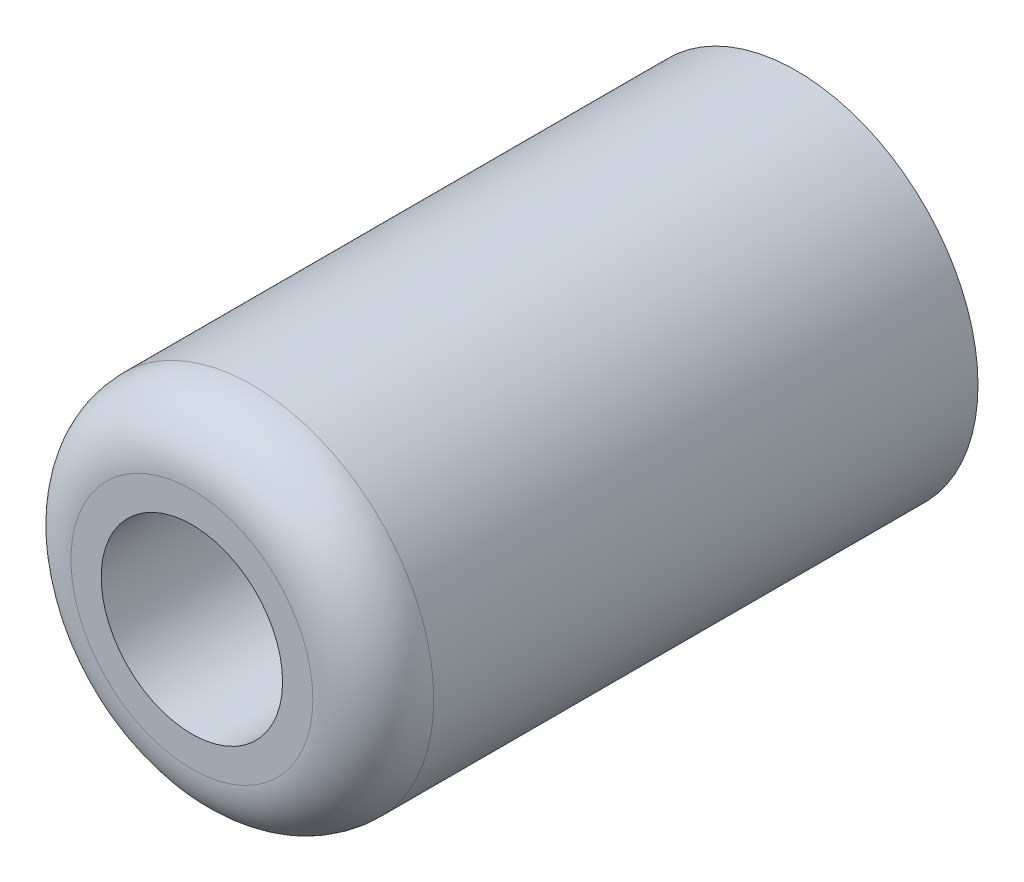
ISO-10303-21;
HEADER;
FILE_DESCRIPTION(('STEP AP214'),'2;1');
FILE_NAME('part.step','',(''),(''),'','','');
FILE_SCHEMA(('AUTOMOTIVE_DESIGN { 1 0 10303 214 1 1 1 1 }'));
ENDSEC;
DATA;
#1=APPLICATION_CONTEXT('core data for automotive mechanical design processes');
#2=APPLICATION_PROTOCOL_DEFINITION('international standard','automotive_design',2000,#1);
#3=PRODUCT_CONTEXT('',#1,'mechanical');
#4=PRODUCT('Part','Part','',(#3));
#5=PRODUCT_RELATED_PRODUCT_CATEGORY('part','',(#4));
#6=PRODUCT_DEFINITION_FORMATION('','',#4);
#7=PRODUCT_DEFINITION_CONTEXT('part definition',#1,'design');
#8=PRODUCT_DEFINITION('design','',#6,#7);
#9=PRODUCT_DEFINITION_SHAPE('','',#8);
#10=(LENGTH_UNIT() NAMED_UNIT(*) SI_UNIT(.MILLI.,.METRE.));
#11=(NAMED_UNIT(*) PLANE_ANGLE_UNIT() SI_UNIT($,.RADIAN.));
#12=(NAMED_UNIT(*) SI_UNIT($,.STERADIAN.) SOLID_ANGLE_UNIT());
#13=UNCERTAINTY_MEASURE_WITH_UNIT(LENGTH_MEASURE(1.E-05),#10,'distance_accuracy_value','');
#14=(GEOMETRIC_REPRESENTATION_CONTEXT(3) GLOBAL_UNCERTAINTY_ASSIGNED_CONTEXT((#13)) GLOBAL_UNIT_ASSIGNED_CONTEXT((#10,
#11,#12)) REPRESENTATION_CONTEXT('',''));
#15=CARTESIAN_POINT('',(0.,0.,0.));
#16=DIRECTION('',(0.,0.,1.));
#17=DIRECTION('',(1.,0.,0.));
#18=AXIS2_PLACEMENT_3D('',#15,#16,#17);
#19=CARTESIAN_POINT('',(0.,0.,20.));
#20=DIRECTION('',(0.,0.,1.));
#21=DIRECTION('',(1.,0.,0.));
#22=AXIS2_PLACEMENT_3D('',#19,#20,#21);
#23=PLANE('',#22);
#24=CARTESIAN_POINT('',(0.,0.,20.));
#25=DIRECTION('',(0.,0.,1.));
#26=DIRECTION('',(1.,0.,0.));
#27=AXIS2_PLACEMENT_3D('',#24,#25,#26);
#28=CIRCLE('',#27,4.);
#29=CARTESIAN_POINT('',(4.,0.,20.));
#30=VERTEX_POINT('',#29);
#31=EDGE_CURVE('E44',#30,#30,#28,.T.);
#32=ORIENTED_EDGE('',*,*,#31,.T.);
#33=EDGE_LOOP('',(#32));
#34=FACE_BOUND('',#33,.T.);
#35=CARTESIAN_POINT('',(0.,0.,20.));
#36=DIRECTION('',(0.,0.,1.));
#37=DIRECTION('',(1.,0.,0.));
#38=AXIS2_PLACEMENT_3D('',#35,#36,#37);
#39=CIRCLE('',#38,3.);
#40=CARTESIAN_POINT('',(3.,0.,20.));
#41=VERTEX_POINT('',#40);
#42=EDGE_CURVE('E54',#41,#41,#39,.T.);
#43=ORIENTED_EDGE('',*,*,#42,.F.);
#44=EDGE_LOOP('',(#43));
#45=FACE_BOUND('',#44,.T.);
#46=ADVANCED_FACE('F36',(#34,#45),#23,.T.);
#47=CARTESIAN_POINT('',(0.,0.,0.));
#48=DIRECTION('',(0.,0.,1.));
#49=DIRECTION('',(1.,0.,0.));
#50=AXIS2_PLACEMENT_3D('',#47,#48,#49);
#51=PLANE('',#50);
#52=CARTESIAN_POINT('',(0.,0.,0.));
#53=DIRECTION('',(0.,0.,1.));
#54=DIRECTION('',(1.,0.,0.));
#55=AXIS2_PLACEMENT_3D('',#52,#53,#54);
#56=CIRCLE('',#55,6.);
#57=CARTESIAN_POINT('',(6.,0.,0.));
#58=VERTEX_POINT('',#57);
#59=EDGE_CURVE('E49',#58,#58,#56,.T.);
#60=ORIENTED_EDGE('',*,*,#59,.F.);
#61=EDGE_LOOP('',(#60));
#62=FACE_BOUND('',#61,.T.);
#63=CARTESIAN_POINT('',(0.,0.,0.));
#64=DIRECTION('',(0.,0.,1.));
#65=DIRECTION('',(1.,0.,0.));
#66=AXIS2_PLACEMENT_3D('',#63,#64,#65);
#67=CIRCLE('',#66,3.);
#68=CARTESIAN_POINT('',(3.,0.,0.));
#69=VERTEX_POINT('',#68);
#70=EDGE_CURVE('E57',#69,#69,#67,.T.);
#71=ORIENTED_EDGE('',*,*,#70,.T.);
#72=EDGE_LOOP('',(#71));
#73=FACE_BOUND('',#72,.T.);
#74=ADVANCED_FACE('F69',(#62,#73),#51,.F.);
#75=CARTESIAN_POINT('',(0.,0.,20.));
#76=DIRECTION('',(0.,0.,-1.));
#77=DIRECTION('',(-1.,0.,0.));
#78=AXIS2_PLACEMENT_3D('',#75,#76,#77);
#79=CYLINDRICAL_SURFACE('',#78,6.);
#80=CARTESIAN_POINT('',(0.,0.,18.));
#81=DIRECTION('',(0.,0.,1.));
#82=DIRECTION('',(1.,0.,0.));
#83=AXIS2_PLACEMENT_3D('',#80,#81,#82);
#84=CIRCLE('',#83,6.);
#85=CARTESIAN_POINT('',(6.,0.,18.));
#86=VERTEX_POINT('',#85);
#87=EDGE_CURVE('E10',#86,#86,#84,.F.);
#88=ORIENTED_EDGE('',*,*,#87,.T.);
#89=EDGE_LOOP('',(#88));
#90=FACE_BOUND('',#89,.T.);
#91=ORIENTED_EDGE('',*,*,#59,.T.);
#92=EDGE_LOOP('',(#91));
#93=FACE_BOUND('',#92,.T.);
#94=ADVANCED_FACE('F76',(#90,#93),#79,.T.);
#95=CARTESIAN_POINT('',(0.,0.,20.));
#96=DIRECTION('',(0.,0.,-1.));
#97=DIRECTION('',(-1.,0.,0.));
#98=AXIS2_PLACEMENT_3D('',#95,#96,#97);
#99=CYLINDRICAL_SURFACE('',#98,3.);
#100=ORIENTED_EDGE('',*,*,#42,.T.);
#101=EDGE_LOOP('',(#100));
#102=FACE_BOUND('',#101,.T.);
#103=ORIENTED_EDGE('',*,*,#70,.F.);
#104=EDGE_LOOP('',(#103));
#105=FACE_BOUND('',#104,.T.);
#106=ADVANCED_FACE('F65',(#102,#105),#99,.F.);
#107=CARTESIAN_POINT('',(0.,0.,18.));
#108=DIRECTION('',(0.,0.,1.));
#109=DIRECTION('',(1.,0.,0.));
#110=AXIS2_PLACEMENT_3D('',#107,#108,#109);
#111=TOROIDAL_SURFACE('',#110,4.,2.);
#112=ORIENTED_EDGE('',*,*,#87,.F.);
#113=EDGE_LOOP('',(#112));
#114=FACE_BOUND('',#113,.T.);
#115=ORIENTED_EDGE('',*,*,#31,.F.);
#116=EDGE_LOOP('',(#115));
#117=FACE_BOUND('',#116,.T.);
#118=ADVANCED_FACE('F38',(#114,#117),#111,.T.);
#119=CLOSED_SHELL('',(#46,#74,#94,#106,#118));
#120=MANIFOLD_SOLID_BREP('B2',#119);
#121=ADVANCED_BREP_SHAPE_REPRESENTATION('',(#18,#120),#14);
#122=SHAPE_DEFINITION_REPRESENTATION(#9,#121);
ENDSEC;
END-ISO-10303-21;
